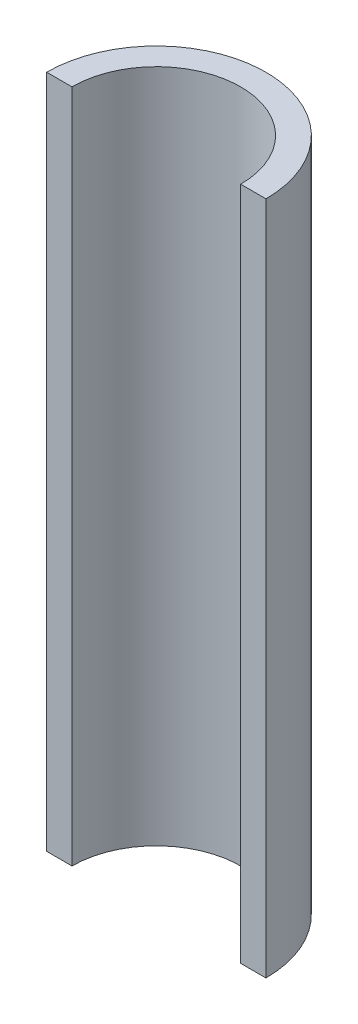
ISO-10303-21;
HEADER;
FILE_DESCRIPTION(('STEP AP214'),'2;1');
FILE_NAME('part.step','',(''),(''),'','','');
FILE_SCHEMA(('AUTOMOTIVE_DESIGN { 1 0 10303 214 1 1 1 1 }'));
ENDSEC;
DATA;
#1=APPLICATION_CONTEXT('core data for automotive mechanical design processes');
#2=APPLICATION_PROTOCOL_DEFINITION('international standard','automotive_design',2000,#1);
#3=PRODUCT_CONTEXT('',#1,'mechanical');
#4=PRODUCT('Part','Part','',(#3));
#5=PRODUCT_RELATED_PRODUCT_CATEGORY('part','',(#4));
#6=PRODUCT_DEFINITION_FORMATION('','',#4);
#7=PRODUCT_DEFINITION_CONTEXT('part definition',#1,'design');
#8=PRODUCT_DEFINITION('design','',#6,#7);
#9=PRODUCT_DEFINITION_SHAPE('','',#8);
#10=(LENGTH_UNIT() NAMED_UNIT(*) SI_UNIT(.MILLI.,.METRE.));
#11=(NAMED_UNIT(*) PLANE_ANGLE_UNIT() SI_UNIT($,.RADIAN.));
#12=(NAMED_UNIT(*) SI_UNIT($,.STERADIAN.) SOLID_ANGLE_UNIT());
#13=UNCERTAINTY_MEASURE_WITH_UNIT(LENGTH_MEASURE(1.E-05),#10,'distance_accuracy_value','');
#14=(GEOMETRIC_REPRESENTATION_CONTEXT(3) GLOBAL_UNCERTAINTY_ASSIGNED_CONTEXT((#13)) GLOBAL_UNIT_ASSIGNED_CONTEXT((#10,
#11,#12)) REPRESENTATION_CONTEXT('',''));
#15=CARTESIAN_POINT('',(0.,0.,0.));
#16=DIRECTION('',(0.,0.,1.));
#17=DIRECTION('',(1.,0.,0.));
#18=AXIS2_PLACEMENT_3D('',#15,#16,#17);
#19=CARTESIAN_POINT('',(0.,80.,0.));
#20=DIRECTION('',(0.,-1.,0.));
#21=DIRECTION('',(0.,0.,-1.));
#22=AXIS2_PLACEMENT_3D('',#19,#20,#21);
#23=CYLINDRICAL_SURFACE('',#22,13.);
#24=CARTESIAN_POINT('',(0.,0.,0.));
#25=DIRECTION('',(0.,1.,0.));
#26=DIRECTION('',(0.,0.,1.));
#27=AXIS2_PLACEMENT_3D('',#24,#25,#26);
#28=CIRCLE('',#27,13.);
#29=CARTESIAN_POINT('',(13.,0.,0.));
#30=VERTEX_POINT('',#29);
#31=CARTESIAN_POINT('',(-13.,0.,0.));
#32=VERTEX_POINT('',#31);
#33=EDGE_CURVE('E96',#30,#32,#28,.T.);
#34=ORIENTED_EDGE('',*,*,#33,.T.);
#35=DIRECTION('',(0.,-1.,0.));
#36=VECTOR('',#35,1.);
#37=CARTESIAN_POINT('',(-13.,80.,0.));
#38=LINE('',#37,#36);
#39=CARTESIAN_POINT('',(-13.,80.,0.));
#40=VERTEX_POINT('',#39);
#41=EDGE_CURVE('E11',#40,#32,#38,.T.);
#42=ORIENTED_EDGE('',*,*,#41,.F.);
#43=CARTESIAN_POINT('',(0.,80.,0.));
#44=DIRECTION('',(0.,1.,0.));
#45=DIRECTION('',(0.,0.,1.));
#46=AXIS2_PLACEMENT_3D('',#43,#44,#45);
#47=CIRCLE('',#46,13.);
#48=CARTESIAN_POINT('',(13.,80.,0.));
#49=VERTEX_POINT('',#48);
#50=EDGE_CURVE('E84',#49,#40,#47,.T.);
#51=ORIENTED_EDGE('',*,*,#50,.F.);
#52=DIRECTION('',(0.,-1.,0.));
#53=VECTOR('',#52,1.);
#54=CARTESIAN_POINT('',(13.,80.,0.));
#55=LINE('',#54,#53);
#56=EDGE_CURVE('E92',#49,#30,#55,.T.);
#57=ORIENTED_EDGE('',*,*,#56,.T.);
#58=EDGE_LOOP('',(#34,#42,#51,#57));
#59=FACE_BOUND('',#58,.T.);
#60=ADVANCED_FACE('F33',(#59),#23,.T.);
#61=CARTESIAN_POINT('',(-13.,80.,0.));
#62=DIRECTION('',(0.,0.,-1.));
#63=DIRECTION('',(-1.,0.,0.));
#64=AXIS2_PLACEMENT_3D('',#61,#62,#63);
#65=PLANE('',#64);
#66=DIRECTION('',(1.,0.,0.));
#67=VECTOR('',#66,1.);
#68=CARTESIAN_POINT('',(-13.,0.,0.));
#69=LINE('',#68,#67);
#70=CARTESIAN_POINT('',(-10.,0.,0.));
#71=VERTEX_POINT('',#70);
#72=EDGE_CURVE('E88',#32,#71,#69,.T.);
#73=ORIENTED_EDGE('',*,*,#72,.T.);
#74=DIRECTION('',(0.,-1.,0.));
#75=VECTOR('',#74,1.);
#76=CARTESIAN_POINT('',(-10.,80.,0.));
#77=LINE('',#76,#75);
#78=CARTESIAN_POINT('',(-10.,80.,0.));
#79=VERTEX_POINT('',#78);
#80=EDGE_CURVE('E41',#79,#71,#77,.T.);
#81=ORIENTED_EDGE('',*,*,#80,.F.);
#82=DIRECTION('',(1.,0.,0.));
#83=VECTOR('',#82,1.);
#84=CARTESIAN_POINT('',(-13.,80.,0.));
#85=LINE('',#84,#83);
#86=EDGE_CURVE('E79',#40,#79,#85,.T.);
#87=ORIENTED_EDGE('',*,*,#86,.F.);
#88=ORIENTED_EDGE('',*,*,#41,.T.);
#89=EDGE_LOOP('',(#73,#81,#87,#88));
#90=FACE_BOUND('',#89,.T.);
#91=ADVANCED_FACE('F87',(#90),#65,.F.);
#92=CARTESIAN_POINT('',(0.,80.,0.));
#93=DIRECTION('',(0.,-1.,0.));
#94=DIRECTION('',(0.,0.,-1.));
#95=AXIS2_PLACEMENT_3D('',#92,#93,#94);
#96=CYLINDRICAL_SURFACE('',#95,10.);
#97=CARTESIAN_POINT('',(0.,0.,0.));
#98=DIRECTION('',(0.,-1.,0.));
#99=DIRECTION('',(0.,0.,1.));
#100=AXIS2_PLACEMENT_3D('',#97,#98,#99);
#101=CIRCLE('',#100,10.);
#102=CARTESIAN_POINT('',(10.,0.,0.));
#103=VERTEX_POINT('',#102);
#104=EDGE_CURVE('E66',#71,#103,#101,.T.);
#105=ORIENTED_EDGE('',*,*,#104,.T.);
#106=DIRECTION('',(0.,-1.,0.));
#107=VECTOR('',#106,1.);
#108=CARTESIAN_POINT('',(10.,80.,0.));
#109=LINE('',#108,#107);
#110=CARTESIAN_POINT('',(10.,80.,0.));
#111=VERTEX_POINT('',#110);
#112=EDGE_CURVE('E89',#111,#103,#109,.T.);
#113=ORIENTED_EDGE('',*,*,#112,.F.);
#114=CARTESIAN_POINT('',(0.,80.,0.));
#115=DIRECTION('',(0.,-1.,0.));
#116=DIRECTION('',(0.,0.,1.));
#117=AXIS2_PLACEMENT_3D('',#114,#115,#116);
#118=CIRCLE('',#117,10.);
#119=EDGE_CURVE('E82',#79,#111,#118,.T.);
#120=ORIENTED_EDGE('',*,*,#119,.F.);
#121=ORIENTED_EDGE('',*,*,#80,.T.);
#122=EDGE_LOOP('',(#105,#113,#120,#121));
#123=FACE_BOUND('',#122,.T.);
#124=ADVANCED_FACE('F90',(#123),#96,.F.);
#125=CARTESIAN_POINT('',(10.,80.,0.));
#126=DIRECTION('',(0.,0.,-1.));
#127=DIRECTION('',(-1.,0.,0.));
#128=AXIS2_PLACEMENT_3D('',#125,#126,#127);
#129=PLANE('',#128);
#130=DIRECTION('',(1.,0.,0.));
#131=VECTOR('',#130,1.);
#132=CARTESIAN_POINT('',(10.,0.,0.));
#133=LINE('',#132,#131);
#134=EDGE_CURVE('E72',#103,#30,#133,.T.);
#135=ORIENTED_EDGE('',*,*,#134,.T.);
#136=ORIENTED_EDGE('',*,*,#56,.F.);
#137=DIRECTION('',(1.,0.,0.));
#138=VECTOR('',#137,1.);
#139=CARTESIAN_POINT('',(10.,80.,0.));
#140=LINE('',#139,#138);
#141=EDGE_CURVE('E49',#111,#49,#140,.T.);
#142=ORIENTED_EDGE('',*,*,#141,.F.);
#143=ORIENTED_EDGE('',*,*,#112,.T.);
#144=EDGE_LOOP('',(#135,#136,#142,#143));
#145=FACE_BOUND('',#144,.T.);
#146=ADVANCED_FACE('F103',(#145),#129,.F.);
#147=CARTESIAN_POINT('',(0.,80.,0.));
#148=DIRECTION('',(0.,1.,0.));
#149=DIRECTION('',(0.,0.,1.));
#150=AXIS2_PLACEMENT_3D('',#147,#148,#149);
#151=PLANE('',#150);
#152=ORIENTED_EDGE('',*,*,#50,.T.);
#153=ORIENTED_EDGE('',*,*,#86,.T.);
#154=ORIENTED_EDGE('',*,*,#119,.T.);
#155=ORIENTED_EDGE('',*,*,#141,.T.);
#156=EDGE_LOOP('',(#152,#153,#154,#155));
#157=FACE_BOUND('',#156,.T.);
#158=ADVANCED_FACE('F80',(#157),#151,.T.);
#159=CARTESIAN_POINT('',(0.,0.,0.));
#160=DIRECTION('',(0.,1.,0.));
#161=DIRECTION('',(0.,0.,1.));
#162=AXIS2_PLACEMENT_3D('',#159,#160,#161);
#163=PLANE('',#162);
#164=ORIENTED_EDGE('',*,*,#33,.F.);
#165=ORIENTED_EDGE('',*,*,#134,.F.);
#166=ORIENTED_EDGE('',*,*,#104,.F.);
#167=ORIENTED_EDGE('',*,*,#72,.F.);
#168=EDGE_LOOP('',(#164,#165,#166,#167));
#169=FACE_BOUND('',#168,.T.);
#170=ADVANCED_FACE('F106',(#169),#163,.F.);
#171=CLOSED_SHELL('',(#60,#91,#124,#146,#158,#170));
#172=MANIFOLD_SOLID_BREP('B2',#171);
#173=ADVANCED_BREP_SHAPE_REPRESENTATION('',(#18,#172),#14);
#174=SHAPE_DEFINITION_REPRESENTATION(#9,#173);
ENDSEC;
END-ISO-10303-21;
